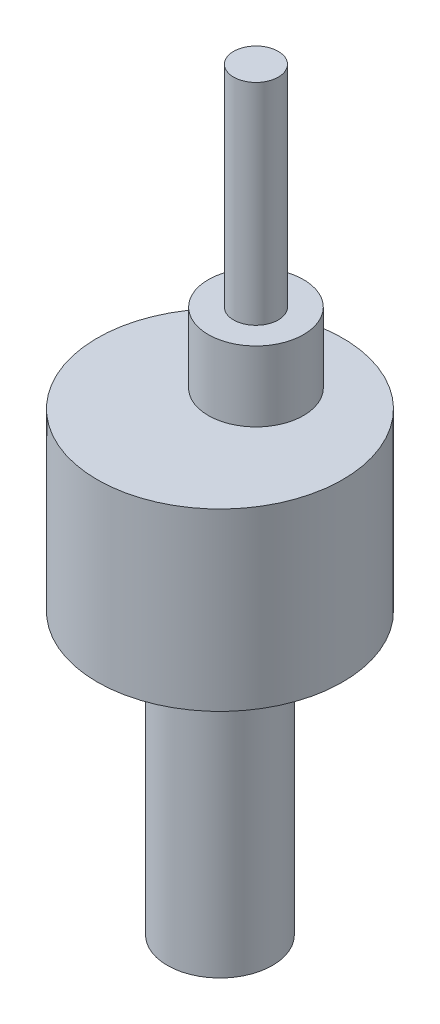
ISO-10303-21;
HEADER;
FILE_DESCRIPTION(('STEP AP214'),'2;1');
FILE_NAME('part.step','',(''),(''),'','','');
FILE_SCHEMA(('AUTOMOTIVE_DESIGN { 1 0 10303 214 1 1 1 1 }'));
ENDSEC;
DATA;
#1=APPLICATION_CONTEXT('core data for automotive mechanical design processes');
#2=APPLICATION_PROTOCOL_DEFINITION('international standard','automotive_design',2000,#1);
#3=PRODUCT_CONTEXT('',#1,'mechanical');
#4=PRODUCT('Part','Part','',(#3));
#5=PRODUCT_RELATED_PRODUCT_CATEGORY('part','',(#4));
#6=PRODUCT_DEFINITION_FORMATION('','',#4);
#7=PRODUCT_DEFINITION_CONTEXT('part definition',#1,'design');
#8=PRODUCT_DEFINITION('design','',#6,#7);
#9=PRODUCT_DEFINITION_SHAPE('','',#8);
#10=(LENGTH_UNIT() NAMED_UNIT(*) SI_UNIT(.MILLI.,.METRE.));
#11=(NAMED_UNIT(*) PLANE_ANGLE_UNIT() SI_UNIT($,.RADIAN.));
#12=(NAMED_UNIT(*) SI_UNIT($,.STERADIAN.) SOLID_ANGLE_UNIT());
#13=UNCERTAINTY_MEASURE_WITH_UNIT(LENGTH_MEASURE(1.E-05),#10,'distance_accuracy_value','');
#14=(GEOMETRIC_REPRESENTATION_CONTEXT(3) GLOBAL_UNCERTAINTY_ASSIGNED_CONTEXT((#13)) GLOBAL_UNIT_ASSIGNED_CONTEXT((#10,
#11,#12)) REPRESENTATION_CONTEXT('',''));
#15=CARTESIAN_POINT('',(0.,0.,0.));
#16=DIRECTION('',(0.,0.,1.));
#17=DIRECTION('',(1.,0.,0.));
#18=AXIS2_PLACEMENT_3D('',#15,#16,#17);
#19=CARTESIAN_POINT('',(0.,120.,0.));
#20=DIRECTION('',(0.,-1.,0.));
#21=DIRECTION('',(0.,0.,-1.));
#22=AXIS2_PLACEMENT_3D('',#19,#20,#21);
#23=CYLINDRICAL_SURFACE('',#22,22.5);
#24=CARTESIAN_POINT('',(0.,120.,0.));
#25=DIRECTION('',(0.,1.,0.));
#26=DIRECTION('',(0.,0.,1.));
#27=AXIS2_PLACEMENT_3D('',#24,#25,#26);
#28=CIRCLE('',#27,22.5);
#29=CARTESIAN_POINT('',(0.,120.,22.5));
#30=VERTEX_POINT('',#29);
#31=EDGE_CURVE('E51',#30,#30,#28,.T.);
#32=ORIENTED_EDGE('',*,*,#31,.F.);
#33=EDGE_LOOP('',(#32));
#34=FACE_BOUND('',#33,.T.);
#35=CARTESIAN_POINT('',(0.,0.,0.));
#36=DIRECTION('',(0.,1.,0.));
#37=DIRECTION('',(0.,0.,1.));
#38=AXIS2_PLACEMENT_3D('',#35,#36,#37);
#39=CIRCLE('',#38,22.5);
#40=CARTESIAN_POINT('',(0.,0.,22.5));
#41=VERTEX_POINT('',#40);
#42=EDGE_CURVE('E40',#41,#41,#39,.T.);
#43=ORIENTED_EDGE('',*,*,#42,.T.);
#44=EDGE_LOOP('',(#43));
#45=FACE_BOUND('',#44,.T.);
#46=ADVANCED_FACE('F37',(#34,#45),#23,.T.);
#47=CARTESIAN_POINT('',(0.,0.,0.));
#48=DIRECTION('',(0.,1.,0.));
#49=DIRECTION('',(0.,0.,1.));
#50=AXIS2_PLACEMENT_3D('',#47,#48,#49);
#51=PLANE('',#50);
#52=ORIENTED_EDGE('',*,*,#42,.F.);
#53=EDGE_LOOP('',(#52));
#54=FACE_BOUND('',#53,.T.);
#55=ADVANCED_FACE('F76',(#54),#51,.F.);
#56=CARTESIAN_POINT('',(0.,195.,0.));
#57=DIRECTION('',(0.,-1.,0.));
#58=DIRECTION('',(0.,0.,-1.));
#59=AXIS2_PLACEMENT_3D('',#56,#57,#58);
#60=CYLINDRICAL_SURFACE('',#59,52.5);
#61=CARTESIAN_POINT('',(0.,195.,0.));
#62=DIRECTION('',(0.,1.,0.));
#63=DIRECTION('',(0.,0.,1.));
#64=AXIS2_PLACEMENT_3D('',#61,#62,#63);
#65=CIRCLE('',#64,52.5);
#66=CARTESIAN_POINT('',(0.,195.,52.5));
#67=VERTEX_POINT('',#66);
#68=EDGE_CURVE('E61',#67,#67,#65,.T.);
#69=ORIENTED_EDGE('',*,*,#68,.F.);
#70=EDGE_LOOP('',(#69));
#71=FACE_BOUND('',#70,.T.);
#72=CARTESIAN_POINT('',(0.,120.,0.));
#73=DIRECTION('',(0.,1.,0.));
#74=DIRECTION('',(0.,0.,1.));
#75=AXIS2_PLACEMENT_3D('',#72,#73,#74);
#76=CIRCLE('',#75,52.5);
#77=CARTESIAN_POINT('',(0.,120.,52.5));
#78=VERTEX_POINT('',#77);
#79=EDGE_CURVE('E59',#78,#78,#76,.T.);
#80=ORIENTED_EDGE('',*,*,#79,.T.);
#81=EDGE_LOOP('',(#80));
#82=FACE_BOUND('',#81,.T.);
#83=ADVANCED_FACE('F78',(#71,#82),#60,.T.);
#84=CARTESIAN_POINT('',(0.,195.,0.));
#85=DIRECTION('',(0.,1.,0.));
#86=DIRECTION('',(0.,0.,1.));
#87=AXIS2_PLACEMENT_3D('',#84,#85,#86);
#88=PLANE('',#87);
#89=CARTESIAN_POINT('',(0.,195.,-15.4068352145137));
#90=DIRECTION('',(0.,1.,0.));
#91=DIRECTION('',(0.,0.,1.));
#92=AXIS2_PLACEMENT_3D('',#89,#90,#91);
#93=CIRCLE('',#92,20.3821656050955);
#94=CARTESIAN_POINT('',(0.,195.,4.97533039058182));
#95=VERTEX_POINT('',#94);
#96=EDGE_CURVE('E45',#95,#95,#93,.T.);
#97=ORIENTED_EDGE('',*,*,#96,.F.);
#98=EDGE_LOOP('',(#97));
#99=FACE_BOUND('',#98,.T.);
#100=ORIENTED_EDGE('',*,*,#68,.T.);
#101=EDGE_LOOP('',(#100));
#102=FACE_BOUND('',#101,.T.);
#103=ADVANCED_FACE('F83',(#99,#102),#88,.T.);
#104=CARTESIAN_POINT('',(0.,120.,0.));
#105=DIRECTION('',(0.,1.,0.));
#106=DIRECTION('',(0.,0.,1.));
#107=AXIS2_PLACEMENT_3D('',#104,#105,#106);
#108=PLANE('',#107);
#109=ORIENTED_EDGE('',*,*,#31,.T.);
#110=EDGE_LOOP('',(#109));
#111=FACE_BOUND('',#110,.T.);
#112=ORIENTED_EDGE('',*,*,#79,.F.);
#113=EDGE_LOOP('',(#112));
#114=FACE_BOUND('',#113,.T.);
#115=ADVANCED_FACE('F88',(#111,#114),#108,.F.);
#116=CARTESIAN_POINT('',(0.,225.,-15.4068352145137));
#117=DIRECTION('',(0.,-1.,0.));
#118=DIRECTION('',(0.,0.,-1.));
#119=AXIS2_PLACEMENT_3D('',#116,#117,#118);
#120=CYLINDRICAL_SURFACE('',#119,20.3821656050955);
#121=CARTESIAN_POINT('',(0.,225.,-15.4068352145137));
#122=DIRECTION('',(0.,1.,0.));
#123=DIRECTION('',(0.,0.,1.));
#124=AXIS2_PLACEMENT_3D('',#121,#122,#123);
#125=CIRCLE('',#124,20.3821656050955);
#126=CARTESIAN_POINT('',(0.,225.,4.97533039058182));
#127=VERTEX_POINT('',#126);
#128=EDGE_CURVE('E56',#127,#127,#125,.T.);
#129=ORIENTED_EDGE('',*,*,#128,.F.);
#130=EDGE_LOOP('',(#129));
#131=FACE_BOUND('',#130,.T.);
#132=ORIENTED_EDGE('',*,*,#96,.T.);
#133=EDGE_LOOP('',(#132));
#134=FACE_BOUND('',#133,.T.);
#135=ADVANCED_FACE('F91',(#131,#134),#120,.T.);
#136=CARTESIAN_POINT('',(0.,225.,-15.4068352145137));
#137=DIRECTION('',(0.,1.,0.));
#138=DIRECTION('',(0.,0.,1.));
#139=AXIS2_PLACEMENT_3D('',#136,#137,#138);
#140=PLANE('',#139);
#141=CARTESIAN_POINT('',(0.,225.,-15.4068352145137));
#142=DIRECTION('',(0.,1.,0.));
#143=DIRECTION('',(0.,0.,1.));
#144=AXIS2_PLACEMENT_3D('',#141,#142,#143);
#145=CIRCLE('',#144,9.55414012738853);
#146=CARTESIAN_POINT('',(0.,225.,-24.9609753419023));
#147=VERTEX_POINT('',#146);
#148=EDGE_CURVE('E10',#147,#147,#145,.T.);
#149=ORIENTED_EDGE('',*,*,#148,.F.);
#150=EDGE_LOOP('',(#149));
#151=FACE_BOUND('',#150,.T.);
#152=ORIENTED_EDGE('',*,*,#128,.T.);
#153=EDGE_LOOP('',(#152));
#154=FACE_BOUND('',#153,.T.);
#155=ADVANCED_FACE('F97',(#151,#154),#140,.T.);
#156=CARTESIAN_POINT('',(0.,315.,-15.4068352145137));
#157=DIRECTION('',(0.,-1.,0.));
#158=DIRECTION('',(0.,0.,-1.));
#159=AXIS2_PLACEMENT_3D('',#156,#157,#158);
#160=CYLINDRICAL_SURFACE('',#159,9.55414012738853);
#161=CARTESIAN_POINT('',(0.,315.,-15.4068352145137));
#162=DIRECTION('',(0.,1.,0.));
#163=DIRECTION('',(0.,0.,1.));
#164=AXIS2_PLACEMENT_3D('',#161,#162,#163);
#165=CIRCLE('',#164,9.55414012738853);
#166=CARTESIAN_POINT('',(0.,315.,-24.9609753419023));
#167=VERTEX_POINT('',#166);
#168=EDGE_CURVE('E55',#167,#167,#165,.T.);
#169=CARTESIAN_POINT('',(0.,315.,-24.9609753419023));
#170=CARTESIAN_POINT('',(0.,314.0625,-24.9609753419023));
#171=CARTESIAN_POINT('',(0.,313.125,-24.9609753419023));
#172=CARTESIAN_POINT('',(0.,311.25,-24.9609753419023));
#173=CARTESIAN_POINT('',(0.,310.3125,-24.9609753419023));
#174=CARTESIAN_POINT('',(0.,308.4375,-24.9609753419023));
#175=CARTESIAN_POINT('',(0.,307.5,-24.9609753419023));
#176=CARTESIAN_POINT('',(0.,305.625,-24.9609753419023));
#177=CARTESIAN_POINT('',(0.,304.6875,-24.9609753419023));
#178=CARTESIAN_POINT('',(0.,302.8125,-24.9609753419023));
#179=CARTESIAN_POINT('',(0.,301.875,-24.9609753419023));
#180=CARTESIAN_POINT('',(0.,300.,-24.9609753419023));
#181=CARTESIAN_POINT('',(0.,299.0625,-24.9609753419023));
#182=CARTESIAN_POINT('',(0.,297.1875,-24.9609753419023));
#183=CARTESIAN_POINT('',(0.,296.25,-24.9609753419023));
#184=CARTESIAN_POINT('',(0.,294.375,-24.9609753419023));
#185=CARTESIAN_POINT('',(0.,293.4375,-24.9609753419023));
#186=CARTESIAN_POINT('',(0.,291.5625,-24.9609753419023));
#187=CARTESIAN_POINT('',(0.,290.625,-24.9609753419023));
#188=CARTESIAN_POINT('',(0.,288.75,-24.9609753419023));
#189=CARTESIAN_POINT('',(0.,287.8125,-24.9609753419023));
#190=CARTESIAN_POINT('',(0.,285.9375,-24.9609753419023));
#191=CARTESIAN_POINT('',(0.,285.,-24.9609753419023));
#192=CARTESIAN_POINT('',(0.,283.125,-24.9609753419023));
#193=CARTESIAN_POINT('',(0.,282.1875,-24.9609753419023));
#194=CARTESIAN_POINT('',(0.,280.3125,-24.9609753419023));
#195=CARTESIAN_POINT('',(0.,279.375,-24.9609753419023));
#196=CARTESIAN_POINT('',(0.,277.5,-24.9609753419023));
#197=CARTESIAN_POINT('',(0.,276.5625,-24.9609753419023));
#198=CARTESIAN_POINT('',(0.,274.6875,-24.9609753419023));
#199=CARTESIAN_POINT('',(0.,273.75,-24.9609753419023));
#200=CARTESIAN_POINT('',(0.,271.875,-24.9609753419023));
#201=CARTESIAN_POINT('',(0.,270.9375,-24.9609753419023));
#202=CARTESIAN_POINT('',(0.,269.0625,-24.9609753419023));
#203=CARTESIAN_POINT('',(0.,268.125,-24.9609753419023));
#204=CARTESIAN_POINT('',(0.,266.25,-24.9609753419023));
#205=CARTESIAN_POINT('',(0.,265.3125,-24.9609753419023));
#206=CARTESIAN_POINT('',(0.,263.4375,-24.9609753419023));
#207=CARTESIAN_POINT('',(0.,262.5,-24.9609753419023));
#208=CARTESIAN_POINT('',(0.,260.625,-24.9609753419023));
#209=CARTESIAN_POINT('',(0.,259.6875,-24.9609753419023));
#210=CARTESIAN_POINT('',(0.,257.8125,-24.9609753419023));
#211=CARTESIAN_POINT('',(0.,256.875,-24.9609753419023));
#212=CARTESIAN_POINT('',(0.,255.,-24.9609753419023));
#213=CARTESIAN_POINT('',(0.,254.0625,-24.9609753419023));
#214=CARTESIAN_POINT('',(0.,252.1875,-24.9609753419023));
#215=CARTESIAN_POINT('',(0.,251.25,-24.9609753419023));
#216=CARTESIAN_POINT('',(0.,249.375,-24.9609753419023));
#217=CARTESIAN_POINT('',(0.,248.4375,-24.9609753419023));
#218=CARTESIAN_POINT('',(0.,246.5625,-24.9609753419023));
#219=CARTESIAN_POINT('',(0.,245.625,-24.9609753419023));
#220=CARTESIAN_POINT('',(0.,243.75,-24.9609753419023));
#221=CARTESIAN_POINT('',(0.,242.8125,-24.9609753419023));
#222=CARTESIAN_POINT('',(0.,240.9375,-24.9609753419023));
#223=CARTESIAN_POINT('',(0.,240.,-24.9609753419023));
#224=CARTESIAN_POINT('',(0.,238.125,-24.9609753419023));
#225=CARTESIAN_POINT('',(0.,237.1875,-24.9609753419023));
#226=CARTESIAN_POINT('',(0.,235.3125,-24.9609753419023));
#227=CARTESIAN_POINT('',(0.,234.375,-24.9609753419023));
#228=CARTESIAN_POINT('',(0.,232.5,-24.9609753419023));
#229=CARTESIAN_POINT('',(0.,231.5625,-24.9609753419023));
#230=CARTESIAN_POINT('',(0.,229.6875,-24.9609753419023));
#231=CARTESIAN_POINT('',(0.,228.75,-24.9609753419023));
#232=CARTESIAN_POINT('',(0.,226.875,-24.9609753419023));
#233=CARTESIAN_POINT('',(0.,225.9375,-24.9609753419023));
#234=CARTESIAN_POINT('',(0.,225.,-24.9609753419023));
#235=B_SPLINE_CURVE_WITH_KNOTS('',3,(#169,#170,#171,#172,#173,#174,#175,#176,#177,#178,#179,
#180,#181,#182,#183,#184,#185,#186,#187,#188,#189,#190,#191,#192,#193,#194,#195,#196,#197,#198,
#199,#200,#201,#202,#203,#204,#205,#206,#207,#208,#209,#210,#211,#212,#213,#214,#215,#216,#217,
#218,#219,#220,#221,#222,#223,#224,#225,#226,#227,#228,#229,#230,#231,#232,#233,#234),
.UNSPECIFIED.,.F.,.F.,(4,2,2,2,2,2,2,2,2,2,2,2,2,2,2,2,2,2,2,2,2,2,2,2,2,2,2,2,2,2,2,2,4),(0.,
2.81250000000005,5.62500000000005,8.43750000000004,11.25,14.0625,16.875,19.6875,22.5,25.3125,
28.125,30.9375,33.75,36.5625,39.375,42.1875,45.,47.8125,50.625,53.4375,56.25,59.0625,61.875,
64.6875,67.5,70.3125,73.125,75.9375,78.75,81.5625,84.375,87.1875,90.),.UNSPECIFIED.);
#236=EDGE_CURVE('BSEAM101',#167,#147,#235,.T.);
#237=ORIENTED_EDGE('',*,*,#168,.F.);
#238=ORIENTED_EDGE('',*,*,#148,.T.);
#239=ORIENTED_EDGE('',*,*,#236,.T.);
#240=ORIENTED_EDGE('',*,*,#236,.F.);
#241=EDGE_LOOP('',(#237,#239,#238,#240));
#242=FACE_BOUND('',#241,.T.);
#243=ADVANCED_FACE('F101',(#242),#160,.T.);
#244=CARTESIAN_POINT('',(0.,315.,-15.4068352145137));
#245=DIRECTION('',(0.,1.,0.));
#246=DIRECTION('',(0.,0.,1.));
#247=AXIS2_PLACEMENT_3D('',#244,#245,#246);
#248=PLANE('',#247);
#249=ORIENTED_EDGE('',*,*,#168,.T.);
#250=EDGE_LOOP('',(#249));
#251=FACE_BOUND('',#250,.T.);
#252=ADVANCED_FACE('F105',(#251),#248,.T.);
#253=CLOSED_SHELL('',(#46,#55,#83,#103,#115,#135,#155,#243,#252));
#254=MANIFOLD_SOLID_BREP('B2',#253);
#255=ADVANCED_BREP_SHAPE_REPRESENTATION('',(#18,#254),#14);
#256=SHAPE_DEFINITION_REPRESENTATION(#9,#255);
ENDSEC;
END-ISO-10303-21;
